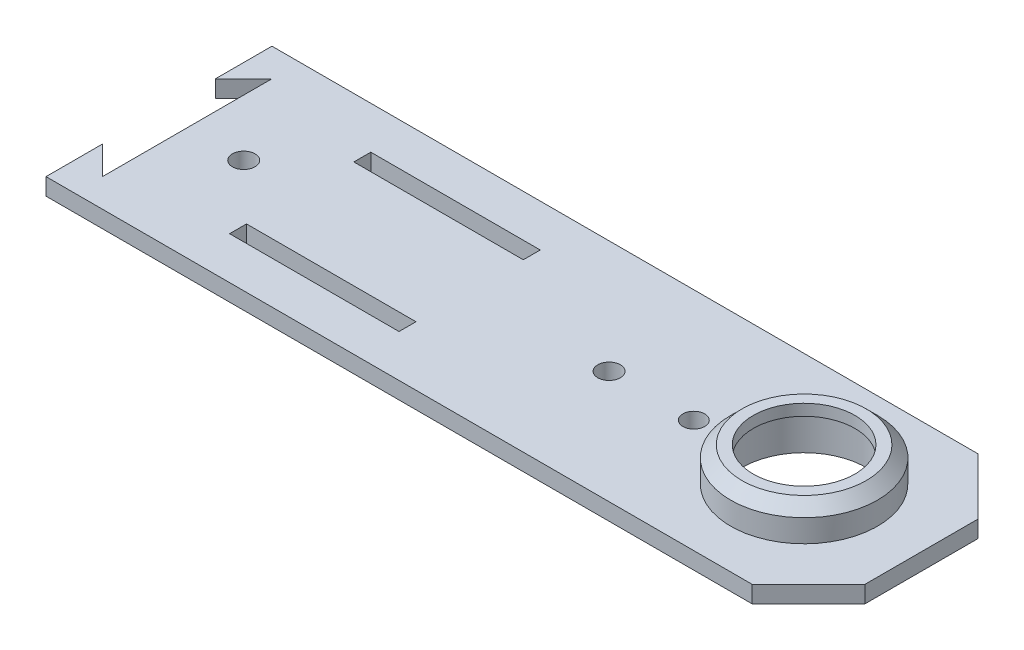
ISO-10303-21;
HEADER;
FILE_DESCRIPTION(('STEP AP214'),'2;1');
FILE_NAME('part.step','',(''),(''),'','','');
FILE_SCHEMA(('AUTOMOTIVE_DESIGN { 1 0 10303 214 1 1 1 1 }'));
ENDSEC;
DATA;
#1=APPLICATION_CONTEXT('core data for automotive mechanical design processes');
#2=APPLICATION_PROTOCOL_DEFINITION('international standard','automotive_design',2000,#1);
#3=PRODUCT_CONTEXT('',#1,'mechanical');
#4=PRODUCT('Part','Part','',(#3));
#5=PRODUCT_RELATED_PRODUCT_CATEGORY('part','',(#4));
#6=PRODUCT_DEFINITION_FORMATION('','',#4);
#7=PRODUCT_DEFINITION_CONTEXT('part definition',#1,'design');
#8=PRODUCT_DEFINITION('design','',#6,#7);
#9=PRODUCT_DEFINITION_SHAPE('','',#8);
#10=(LENGTH_UNIT() NAMED_UNIT(*) SI_UNIT(.MILLI.,.METRE.));
#11=(NAMED_UNIT(*) PLANE_ANGLE_UNIT() SI_UNIT($,.RADIAN.));
#12=(NAMED_UNIT(*) SI_UNIT($,.STERADIAN.) SOLID_ANGLE_UNIT());
#13=UNCERTAINTY_MEASURE_WITH_UNIT(LENGTH_MEASURE(1.E-05),#10,'distance_accuracy_value','');
#14=(GEOMETRIC_REPRESENTATION_CONTEXT(3) GLOBAL_UNCERTAINTY_ASSIGNED_CONTEXT((#13)) GLOBAL_UNIT_ASSIGNED_CONTEXT((#10,
#11,#12)) REPRESENTATION_CONTEXT('',''));
#15=CARTESIAN_POINT('',(0.,0.,0.));
#16=DIRECTION('',(0.,0.,1.));
#17=DIRECTION('',(1.,0.,0.));
#18=AXIS2_PLACEMENT_3D('',#15,#16,#17);
#19=CARTESIAN_POINT('',(0.,3.,0.));
#20=DIRECTION('',(0.,-1.,0.));
#21=DIRECTION('',(0.,0.,-1.));
#22=AXIS2_PLACEMENT_3D('',#19,#20,#21);
#23=PLANE('',#22);
#24=DIRECTION('',(0.,0.,-1.));
#25=VECTOR('',#24,1.);
#26=CARTESIAN_POINT('',(-12.5,3.,12.5));
#27=LINE('',#26,#25);
#28=CARTESIAN_POINT('',(-12.5,3.,12.5));
#29=VERTEX_POINT('',#28);
#30=CARTESIAN_POINT('',(-12.5,3.,9.5));
#31=VERTEX_POINT('',#30);
#32=EDGE_CURVE('E170',#29,#31,#27,.T.);
#33=ORIENTED_EDGE('',*,*,#32,.F.);
#34=DIRECTION('',(1.,0.,0.));
#35=VECTOR('',#34,1.);
#36=CARTESIAN_POINT('',(-42.5,3.,12.5));
#37=LINE('',#36,#35);
#38=CARTESIAN_POINT('',(-42.5,3.,12.5));
#39=VERTEX_POINT('',#38);
#40=EDGE_CURVE('E196',#39,#29,#37,.T.);
#41=ORIENTED_EDGE('',*,*,#40,.F.);
#42=DIRECTION('',(0.,0.,1.));
#43=VECTOR('',#42,1.);
#44=CARTESIAN_POINT('',(-42.5,3.,12.5));
#45=LINE('',#44,#43);
#46=CARTESIAN_POINT('',(-42.5,3.,9.5));
#47=VERTEX_POINT('',#46);
#48=EDGE_CURVE('E194',#47,#39,#45,.T.);
#49=ORIENTED_EDGE('',*,*,#48,.F.);
#50=DIRECTION('',(-1.,0.,0.));
#51=VECTOR('',#50,1.);
#52=CARTESIAN_POINT('',(-42.5,3.,9.5));
#53=LINE('',#52,#51);
#54=EDGE_CURVE('E180',#31,#47,#53,.T.);
#55=ORIENTED_EDGE('',*,*,#54,.F.);
#56=EDGE_LOOP('',(#33,#41,#49,#55));
#57=FACE_BOUND('',#56,.T.);
#58=CARTESIAN_POINT('',(12.1857700369203,3.,0.));
#59=DIRECTION('',(0.,1.,0.));
#60=DIRECTION('',(0.,0.,1.));
#61=AXIS2_PLACEMENT_3D('',#58,#59,#60);
#62=CIRCLE('',#61,2.);
#63=CARTESIAN_POINT('',(12.1857700369203,3.,2.));
#64=VERTEX_POINT('',#63);
#65=EDGE_CURVE('E254',#64,#64,#62,.T.);
#66=ORIENTED_EDGE('',*,*,#65,.F.);
#67=EDGE_LOOP('',(#66));
#68=FACE_BOUND('',#67,.T.);
#69=CARTESIAN_POINT('',(27.1857700369203,3.,0.));
#70=DIRECTION('',(0.,1.,0.));
#71=DIRECTION('',(0.,0.,1.));
#72=AXIS2_PLACEMENT_3D('',#69,#70,#71);
#73=CIRCLE('',#72,1.93767259060063);
#74=CARTESIAN_POINT('',(27.1857700369203,3.,1.93767259060063));
#75=VERTEX_POINT('',#74);
#76=EDGE_CURVE('E260',#75,#75,#73,.T.);
#77=ORIENTED_EDGE('',*,*,#76,.F.);
#78=EDGE_LOOP('',(#77));
#79=FACE_BOUND('',#78,.T.);
#80=DIRECTION('',(1.,0.,0.));
#81=VECTOR('',#80,1.);
#82=CARTESIAN_POINT('',(-67.5,3.,20.));
#83=LINE('',#82,#81);
#84=CARTESIAN_POINT('',(-67.5,3.,20.));
#85=VERTEX_POINT('',#84);
#86=CARTESIAN_POINT('',(57.5,3.,20.));
#87=VERTEX_POINT('',#86);
#88=EDGE_CURVE('E281',#85,#87,#83,.T.);
#89=ORIENTED_EDGE('',*,*,#88,.T.);
#90=DIRECTION('',(-0.707106781186548,0.,0.707106781186547));
#91=VECTOR('',#90,1.);
#92=CARTESIAN_POINT('',(67.5,3.,9.99999999999999));
#93=LINE('',#92,#91);
#94=CARTESIAN_POINT('',(67.5,3.,9.99999999999999));
#95=VERTEX_POINT('',#94);
#96=EDGE_CURVE('E49',#87,#95,#93,.F.);
#97=ORIENTED_EDGE('',*,*,#96,.T.);
#98=DIRECTION('',(0.,0.,-1.));
#99=VECTOR('',#98,1.);
#100=CARTESIAN_POINT('',(67.5,3.,20.));
#101=LINE('',#100,#99);
#102=CARTESIAN_POINT('',(67.5,3.,-9.99999999999995));
#103=VERTEX_POINT('',#102);
#104=EDGE_CURVE('E266',#95,#103,#101,.T.);
#105=ORIENTED_EDGE('',*,*,#104,.T.);
#106=DIRECTION('',(0.707106781186546,0.,0.707106781186549));
#107=VECTOR('',#106,1.);
#108=CARTESIAN_POINT('',(57.5,3.,-20.));
#109=LINE('',#108,#107);
#110=CARTESIAN_POINT('',(57.5,3.,-20.));
#111=VERTEX_POINT('',#110);
#112=EDGE_CURVE('E56',#103,#111,#109,.F.);
#113=ORIENTED_EDGE('',*,*,#112,.T.);
#114=DIRECTION('',(-1.,0.,0.));
#115=VECTOR('',#114,1.);
#116=CARTESIAN_POINT('',(-67.5,3.,-20.));
#117=LINE('',#116,#115);
#118=CARTESIAN_POINT('',(-67.5,3.,-20.));
#119=VERTEX_POINT('',#118);
#120=EDGE_CURVE('E268',#111,#119,#117,.T.);
#121=ORIENTED_EDGE('',*,*,#120,.T.);
#122=DIRECTION('',(0.,0.,1.));
#123=VECTOR('',#122,1.);
#124=CARTESIAN_POINT('',(-67.5,3.,-10.0000000000001));
#125=LINE('',#124,#123);
#126=CARTESIAN_POINT('',(-67.5,3.,-10.0000000000001));
#127=VERTEX_POINT('',#126);
#128=EDGE_CURVE('E271',#119,#127,#125,.T.);
#129=ORIENTED_EDGE('',*,*,#128,.T.);
#130=DIRECTION('',(0.707106781186548,0.,-0.707106781186547));
#131=VECTOR('',#130,1.);
#132=CARTESIAN_POINT('',(-67.5,3.,-10.0000000000001));
#133=LINE('',#132,#131);
#134=CARTESIAN_POINT('',(-62.5,3.,-15.));
#135=VERTEX_POINT('',#134);
#136=EDGE_CURVE('E273',#127,#135,#133,.T.);
#137=ORIENTED_EDGE('',*,*,#136,.T.);
#138=DIRECTION('',(0.,0.,1.));
#139=VECTOR('',#138,1.);
#140=CARTESIAN_POINT('',(-62.5,3.,-15.));
#141=LINE('',#140,#139);
#142=CARTESIAN_POINT('',(-62.5,3.,15.));
#143=VERTEX_POINT('',#142);
#144=EDGE_CURVE('E275',#135,#143,#141,.T.);
#145=ORIENTED_EDGE('',*,*,#144,.T.);
#146=DIRECTION('',(-0.707106781186538,0.,-0.707106781186556));
#147=VECTOR('',#146,1.);
#148=CARTESIAN_POINT('',(-62.5,3.,15.));
#149=LINE('',#148,#147);
#150=CARTESIAN_POINT('',(-67.5,3.,9.99999999999992));
#151=VERTEX_POINT('',#150);
#152=EDGE_CURVE('E277',#143,#151,#149,.T.);
#153=ORIENTED_EDGE('',*,*,#152,.T.);
#154=DIRECTION('',(0.,0.,1.));
#155=VECTOR('',#154,1.);
#156=CARTESIAN_POINT('',(-67.5,3.,20.));
#157=LINE('',#156,#155);
#158=EDGE_CURVE('E279',#151,#85,#157,.T.);
#159=ORIENTED_EDGE('',*,*,#158,.T.);
#160=EDGE_LOOP('',(#89,#97,#105,#113,#121,#129,#137,#145,#153,#159));
#161=FACE_BOUND('',#160,.T.);
#162=DIRECTION('',(0.,0.,-1.));
#163=VECTOR('',#162,1.);
#164=CARTESIAN_POINT('',(-12.5,3.,-9.5));
#165=LINE('',#164,#163);
#166=CARTESIAN_POINT('',(-12.5,3.,-9.5));
#167=VERTEX_POINT('',#166);
#168=CARTESIAN_POINT('',(-12.5,3.,-12.5));
#169=VERTEX_POINT('',#168);
#170=EDGE_CURVE('E220',#167,#169,#165,.T.);
#171=ORIENTED_EDGE('',*,*,#170,.F.);
#172=DIRECTION('',(1.,0.,0.));
#173=VECTOR('',#172,1.);
#174=CARTESIAN_POINT('',(-42.5,3.,-9.5));
#175=LINE('',#174,#173);
#176=CARTESIAN_POINT('',(-42.5,3.,-9.5));
#177=VERTEX_POINT('',#176);
#178=EDGE_CURVE('E228',#177,#167,#175,.T.);
#179=ORIENTED_EDGE('',*,*,#178,.F.);
#180=DIRECTION('',(0.,0.,1.));
#181=VECTOR('',#180,1.);
#182=CARTESIAN_POINT('',(-42.5,3.,-9.5));
#183=LINE('',#182,#181);
#184=CARTESIAN_POINT('',(-42.5,3.,-12.5));
#185=VERTEX_POINT('',#184);
#186=EDGE_CURVE('E225',#185,#177,#183,.T.);
#187=ORIENTED_EDGE('',*,*,#186,.F.);
#188=DIRECTION('',(-1.,0.,0.));
#189=VECTOR('',#188,1.);
#190=CARTESIAN_POINT('',(-42.5,3.,-12.5));
#191=LINE('',#190,#189);
#192=EDGE_CURVE('E222',#169,#185,#191,.T.);
#193=ORIENTED_EDGE('',*,*,#192,.F.);
#194=EDGE_LOOP('',(#171,#179,#187,#193));
#195=FACE_BOUND('',#194,.T.);
#196=CARTESIAN_POINT('',(-52.5,3.,0.));
#197=DIRECTION('',(0.,1.,0.));
#198=DIRECTION('',(0.,0.,1.));
#199=AXIS2_PLACEMENT_3D('',#196,#197,#198);
#200=CIRCLE('',#199,2.);
#201=CARTESIAN_POINT('',(-52.5,3.,2.));
#202=VERTEX_POINT('',#201);
#203=EDGE_CURVE('E214',#202,#202,#200,.T.);
#204=ORIENTED_EDGE('',*,*,#203,.F.);
#205=EDGE_LOOP('',(#204));
#206=FACE_BOUND('',#205,.T.);
#207=CARTESIAN_POINT('',(46.7139511037718,3.,0.));
#208=DIRECTION('',(0.,-1.,0.));
#209=DIRECTION('',(0.,0.,-1.));
#210=AXIS2_PLACEMENT_3D('',#207,#208,#209);
#211=CIRCLE('',#210,13.);
#212=CARTESIAN_POINT('',(46.7139511037718,3.,-13.));
#213=VERTEX_POINT('',#212);
#214=EDGE_CURVE('E316',#213,#213,#211,.F.);
#215=ORIENTED_EDGE('',*,*,#214,.F.);
#216=EDGE_LOOP('',(#215));
#217=FACE_BOUND('',#216,.T.);
#218=ADVANCED_FACE('F40',(#57,#68,#79,#161,#195,#206,#217),#23,.F.);
#219=CARTESIAN_POINT('',(0.,0.,0.));
#220=DIRECTION('',(0.,-1.,0.));
#221=DIRECTION('',(0.,0.,-1.));
#222=AXIS2_PLACEMENT_3D('',#219,#220,#221);
#223=PLANE('',#222);
#224=DIRECTION('',(1.,0.,0.));
#225=VECTOR('',#224,1.);
#226=CARTESIAN_POINT('',(-42.5,0.,-9.5));
#227=LINE('',#226,#225);
#228=CARTESIAN_POINT('',(-42.5,0.,-9.5));
#229=VERTEX_POINT('',#228);
#230=CARTESIAN_POINT('',(-12.5,0.,-9.5));
#231=VERTEX_POINT('',#230);
#232=EDGE_CURVE('E223',#229,#231,#227,.T.);
#233=ORIENTED_EDGE('',*,*,#232,.T.);
#234=DIRECTION('',(0.,0.,-1.));
#235=VECTOR('',#234,1.);
#236=CARTESIAN_POINT('',(-12.5,0.,-9.5));
#237=LINE('',#236,#235);
#238=CARTESIAN_POINT('',(-12.5,0.,-12.5));
#239=VERTEX_POINT('',#238);
#240=EDGE_CURVE('E217',#231,#239,#237,.T.);
#241=ORIENTED_EDGE('',*,*,#240,.T.);
#242=DIRECTION('',(-1.,0.,0.));
#243=VECTOR('',#242,1.);
#244=CARTESIAN_POINT('',(-42.5,0.,-12.5));
#245=LINE('',#244,#243);
#246=CARTESIAN_POINT('',(-42.5,0.,-12.5));
#247=VERTEX_POINT('',#246);
#248=EDGE_CURVE('E233',#239,#247,#245,.T.);
#249=ORIENTED_EDGE('',*,*,#248,.T.);
#250=DIRECTION('',(0.,0.,1.));
#251=VECTOR('',#250,1.);
#252=CARTESIAN_POINT('',(-42.5,0.,-9.5));
#253=LINE('',#252,#251);
#254=EDGE_CURVE('E236',#247,#229,#253,.T.);
#255=ORIENTED_EDGE('',*,*,#254,.T.);
#256=EDGE_LOOP('',(#233,#241,#249,#255));
#257=FACE_BOUND('',#256,.T.);
#258=CARTESIAN_POINT('',(46.7139511037718,0.,0.));
#259=DIRECTION('',(0.,1.,0.));
#260=DIRECTION('',(0.,0.,1.));
#261=AXIS2_PLACEMENT_3D('',#258,#259,#260);
#262=CIRCLE('',#261,11.);
#263=CARTESIAN_POINT('',(46.7139511037718,0.,11.));
#264=VERTEX_POINT('',#263);
#265=EDGE_CURVE('E250',#264,#264,#262,.T.);
#266=ORIENTED_EDGE('',*,*,#265,.T.);
#267=EDGE_LOOP('',(#266));
#268=FACE_BOUND('',#267,.T.);
#269=CARTESIAN_POINT('',(27.1857700369203,0.,0.));
#270=DIRECTION('',(0.,1.,0.));
#271=DIRECTION('',(0.,0.,1.));
#272=AXIS2_PLACEMENT_3D('',#269,#270,#271);
#273=CIRCLE('',#272,1.93767259060063);
#274=CARTESIAN_POINT('',(27.1857700369203,0.,1.93767259060063));
#275=VERTEX_POINT('',#274);
#276=EDGE_CURVE('E257',#275,#275,#273,.T.);
#277=ORIENTED_EDGE('',*,*,#276,.T.);
#278=EDGE_LOOP('',(#277));
#279=FACE_BOUND('',#278,.T.);
#280=DIRECTION('',(0.,0.,-1.));
#281=VECTOR('',#280,1.);
#282=CARTESIAN_POINT('',(67.5,0.,20.));
#283=LINE('',#282,#281);
#284=CARTESIAN_POINT('',(67.5,0.,9.99999999999999));
#285=VERTEX_POINT('',#284);
#286=CARTESIAN_POINT('',(67.5,0.,-9.99999999999995));
#287=VERTEX_POINT('',#286);
#288=EDGE_CURVE('E263',#285,#287,#283,.T.);
#289=ORIENTED_EDGE('',*,*,#288,.F.);
#290=DIRECTION('',(0.707106781186548,0.,-0.707106781186547));
#291=VECTOR('',#290,1.);
#292=CARTESIAN_POINT('',(38.75,0.,38.75));
#293=LINE('',#292,#291);
#294=CARTESIAN_POINT('',(57.5,0.,20.));
#295=VERTEX_POINT('',#294);
#296=EDGE_CURVE('E332',#285,#295,#293,.F.);
#297=ORIENTED_EDGE('',*,*,#296,.T.);
#298=DIRECTION('',(1.,0.,0.));
#299=VECTOR('',#298,1.);
#300=CARTESIAN_POINT('',(-67.5,0.,20.));
#301=LINE('',#300,#299);
#302=CARTESIAN_POINT('',(-67.5,0.,20.));
#303=VERTEX_POINT('',#302);
#304=EDGE_CURVE('E269',#303,#295,#301,.T.);
#305=ORIENTED_EDGE('',*,*,#304,.F.);
#306=DIRECTION('',(0.,0.,1.));
#307=VECTOR('',#306,1.);
#308=CARTESIAN_POINT('',(-67.5,0.,20.));
#309=LINE('',#308,#307);
#310=CARTESIAN_POINT('',(-67.5,0.,9.99999999999992));
#311=VERTEX_POINT('',#310);
#312=EDGE_CURVE('E296',#311,#303,#309,.T.);
#313=ORIENTED_EDGE('',*,*,#312,.F.);
#314=DIRECTION('',(-0.707106781186538,0.,-0.707106781186556));
#315=VECTOR('',#314,1.);
#316=CARTESIAN_POINT('',(-62.5,0.,15.));
#317=LINE('',#316,#315);
#318=CARTESIAN_POINT('',(-62.5,0.,15.));
#319=VERTEX_POINT('',#318);
#320=EDGE_CURVE('E294',#319,#311,#317,.T.);
#321=ORIENTED_EDGE('',*,*,#320,.F.);
#322=DIRECTION('',(0.,0.,1.));
#323=VECTOR('',#322,1.);
#324=CARTESIAN_POINT('',(-62.5,0.,-15.));
#325=LINE('',#324,#323);
#326=CARTESIAN_POINT('',(-62.5,0.,-15.));
#327=VERTEX_POINT('',#326);
#328=EDGE_CURVE('E292',#327,#319,#325,.T.);
#329=ORIENTED_EDGE('',*,*,#328,.F.);
#330=DIRECTION('',(0.707106781186548,0.,-0.707106781186547));
#331=VECTOR('',#330,1.);
#332=CARTESIAN_POINT('',(-67.5,0.,-10.0000000000001));
#333=LINE('',#332,#331);
#334=CARTESIAN_POINT('',(-67.5,0.,-10.0000000000001));
#335=VERTEX_POINT('',#334);
#336=EDGE_CURVE('E290',#335,#327,#333,.T.);
#337=ORIENTED_EDGE('',*,*,#336,.F.);
#338=DIRECTION('',(0.,0.,1.));
#339=VECTOR('',#338,1.);
#340=CARTESIAN_POINT('',(-67.5,0.,-10.0000000000001));
#341=LINE('',#340,#339);
#342=CARTESIAN_POINT('',(-67.5,0.,-20.));
#343=VERTEX_POINT('',#342);
#344=EDGE_CURVE('E288',#343,#335,#341,.T.);
#345=ORIENTED_EDGE('',*,*,#344,.F.);
#346=DIRECTION('',(-1.,0.,0.));
#347=VECTOR('',#346,1.);
#348=CARTESIAN_POINT('',(-67.5,0.,-20.));
#349=LINE('',#348,#347);
#350=CARTESIAN_POINT('',(57.5,0.,-20.));
#351=VERTEX_POINT('',#350);
#352=EDGE_CURVE('E286',#351,#343,#349,.T.);
#353=ORIENTED_EDGE('',*,*,#352,.F.);
#354=DIRECTION('',(-0.707106781186546,0.,-0.707106781186549));
#355=VECTOR('',#354,1.);
#356=CARTESIAN_POINT('',(38.7500000000001,0.,-38.75));
#357=LINE('',#356,#355);
#358=EDGE_CURVE('E330',#351,#287,#357,.F.);
#359=ORIENTED_EDGE('',*,*,#358,.T.);
#360=EDGE_LOOP('',(#289,#297,#305,#313,#321,#329,#337,#345,#353,#359));
#361=FACE_BOUND('',#360,.T.);
#362=CARTESIAN_POINT('',(12.1857700369203,0.,0.));
#363=DIRECTION('',(0.,1.,0.));
#364=DIRECTION('',(0.,0.,1.));
#365=AXIS2_PLACEMENT_3D('',#362,#363,#364);
#366=CIRCLE('',#365,2.);
#367=CARTESIAN_POINT('',(12.1857700369203,0.,2.));
#368=VERTEX_POINT('',#367);
#369=EDGE_CURVE('E253',#368,#368,#366,.T.);
#370=ORIENTED_EDGE('',*,*,#369,.T.);
#371=EDGE_LOOP('',(#370));
#372=FACE_BOUND('',#371,.T.);
#373=CARTESIAN_POINT('',(-52.5,0.,0.));
#374=DIRECTION('',(0.,1.,0.));
#375=DIRECTION('',(0.,0.,1.));
#376=AXIS2_PLACEMENT_3D('',#373,#374,#375);
#377=CIRCLE('',#376,2.);
#378=CARTESIAN_POINT('',(-52.5,0.,2.));
#379=VERTEX_POINT('',#378);
#380=EDGE_CURVE('E188',#379,#379,#377,.T.);
#381=ORIENTED_EDGE('',*,*,#380,.T.);
#382=EDGE_LOOP('',(#381));
#383=FACE_BOUND('',#382,.T.);
#384=DIRECTION('',(1.,0.,0.));
#385=VECTOR('',#384,1.);
#386=CARTESIAN_POINT('',(-42.5,0.,12.5));
#387=LINE('',#386,#385);
#388=CARTESIAN_POINT('',(-42.5,0.,12.5));
#389=VERTEX_POINT('',#388);
#390=CARTESIAN_POINT('',(-12.5,0.,12.5));
#391=VERTEX_POINT('',#390);
#392=EDGE_CURVE('E181',#389,#391,#387,.T.);
#393=ORIENTED_EDGE('',*,*,#392,.T.);
#394=DIRECTION('',(0.,0.,-1.));
#395=VECTOR('',#394,1.);
#396=CARTESIAN_POINT('',(-12.5,0.,12.5));
#397=LINE('',#396,#395);
#398=CARTESIAN_POINT('',(-12.5,0.,9.5));
#399=VERTEX_POINT('',#398);
#400=EDGE_CURVE('E201',#391,#399,#397,.T.);
#401=ORIENTED_EDGE('',*,*,#400,.T.);
#402=DIRECTION('',(-1.,0.,0.));
#403=VECTOR('',#402,1.);
#404=CARTESIAN_POINT('',(-42.5,0.,9.5));
#405=LINE('',#404,#403);
#406=CARTESIAN_POINT('',(-42.5,0.,9.5));
#407=VERTEX_POINT('',#406);
#408=EDGE_CURVE('E187',#399,#407,#405,.T.);
#409=ORIENTED_EDGE('',*,*,#408,.T.);
#410=DIRECTION('',(0.,0.,1.));
#411=VECTOR('',#410,1.);
#412=CARTESIAN_POINT('',(-42.5,0.,12.5));
#413=LINE('',#412,#411);
#414=EDGE_CURVE('E205',#407,#389,#413,.T.);
#415=ORIENTED_EDGE('',*,*,#414,.T.);
#416=EDGE_LOOP('',(#393,#401,#409,#415));
#417=FACE_BOUND('',#416,.T.);
#418=ADVANCED_FACE('F347',(#257,#268,#279,#361,#372,#383,#417),#223,.T.);
#419=CARTESIAN_POINT('',(67.5,3.,20.));
#420=DIRECTION('',(-1.,0.,0.));
#421=DIRECTION('',(0.,0.,1.));
#422=AXIS2_PLACEMENT_3D('',#419,#420,#421);
#423=PLANE('',#422);
#424=ORIENTED_EDGE('',*,*,#104,.F.);
#425=DIRECTION('',(0.,-1.,0.));
#426=VECTOR('',#425,1.);
#427=CARTESIAN_POINT('',(67.5,3.,9.99999999999999));
#428=LINE('',#427,#426);
#429=EDGE_CURVE('E327',#95,#285,#428,.T.);
#430=ORIENTED_EDGE('',*,*,#429,.T.);
#431=ORIENTED_EDGE('',*,*,#288,.T.);
#432=DIRECTION('',(0.,1.,0.));
#433=VECTOR('',#432,1.);
#434=CARTESIAN_POINT('',(67.5,3.,-9.99999999999995));
#435=LINE('',#434,#433);
#436=EDGE_CURVE('E325',#287,#103,#435,.T.);
#437=ORIENTED_EDGE('',*,*,#436,.T.);
#438=EDGE_LOOP('',(#424,#430,#431,#437));
#439=FACE_BOUND('',#438,.T.);
#440=ADVANCED_FACE('F341',(#439),#423,.F.);
#441=CARTESIAN_POINT('',(-67.5,3.,-20.));
#442=DIRECTION('',(0.,0.,1.));
#443=DIRECTION('',(1.,0.,0.));
#444=AXIS2_PLACEMENT_3D('',#441,#442,#443);
#445=PLANE('',#444);
#446=ORIENTED_EDGE('',*,*,#120,.F.);
#447=DIRECTION('',(0.,-1.,0.));
#448=VECTOR('',#447,1.);
#449=CARTESIAN_POINT('',(57.5,3.,-20.));
#450=LINE('',#449,#448);
#451=EDGE_CURVE('E11',#111,#351,#450,.T.);
#452=ORIENTED_EDGE('',*,*,#451,.T.);
#453=ORIENTED_EDGE('',*,*,#352,.T.);
#454=DIRECTION('',(0.,-1.,0.));
#455=VECTOR('',#454,1.);
#456=CARTESIAN_POINT('',(-67.5,3.,-20.));
#457=LINE('',#456,#455);
#458=EDGE_CURVE('E313',#119,#343,#457,.T.);
#459=ORIENTED_EDGE('',*,*,#458,.F.);
#460=EDGE_LOOP('',(#446,#452,#453,#459));
#461=FACE_BOUND('',#460,.T.);
#462=ADVANCED_FACE('F378',(#461),#445,.F.);
#463=CARTESIAN_POINT('',(-67.5,3.,-10.0000000000001));
#464=DIRECTION('',(1.,0.,0.));
#465=DIRECTION('',(0.,0.,-1.));
#466=AXIS2_PLACEMENT_3D('',#463,#464,#465);
#467=PLANE('',#466);
#468=ORIENTED_EDGE('',*,*,#344,.T.);
#469=DIRECTION('',(0.,-1.,0.));
#470=VECTOR('',#469,1.);
#471=CARTESIAN_POINT('',(-67.5,3.,-10.0000000000001));
#472=LINE('',#471,#470);
#473=EDGE_CURVE('E310',#127,#335,#472,.T.);
#474=ORIENTED_EDGE('',*,*,#473,.F.);
#475=ORIENTED_EDGE('',*,*,#128,.F.);
#476=ORIENTED_EDGE('',*,*,#458,.T.);
#477=EDGE_LOOP('',(#468,#474,#475,#476));
#478=FACE_BOUND('',#477,.T.);
#479=ADVANCED_FACE('F374',(#478),#467,.F.);
#480=CARTESIAN_POINT('',(-67.5,3.,-10.0000000000001));
#481=DIRECTION('',(-0.707106781186547,0.,-0.707106781186548));
#482=DIRECTION('',(-0.707106781186548,0.,0.707106781186547));
#483=AXIS2_PLACEMENT_3D('',#480,#481,#482);
#484=PLANE('',#483);
#485=ORIENTED_EDGE('',*,*,#336,.T.);
#486=DIRECTION('',(0.,-1.,0.));
#487=VECTOR('',#486,1.);
#488=CARTESIAN_POINT('',(-62.5,3.,-15.));
#489=LINE('',#488,#487);
#490=EDGE_CURVE('E307',#135,#327,#489,.T.);
#491=ORIENTED_EDGE('',*,*,#490,.F.);
#492=ORIENTED_EDGE('',*,*,#136,.F.);
#493=ORIENTED_EDGE('',*,*,#473,.T.);
#494=EDGE_LOOP('',(#485,#491,#492,#493));
#495=FACE_BOUND('',#494,.T.);
#496=ADVANCED_FACE('F369',(#495),#484,.F.);
#497=CARTESIAN_POINT('',(-62.5,3.,-15.));
#498=DIRECTION('',(1.,0.,0.));
#499=DIRECTION('',(0.,0.,-1.));
#500=AXIS2_PLACEMENT_3D('',#497,#498,#499);
#501=PLANE('',#500);
#502=ORIENTED_EDGE('',*,*,#328,.T.);
#503=DIRECTION('',(0.,-1.,0.));
#504=VECTOR('',#503,1.);
#505=CARTESIAN_POINT('',(-62.5,3.,15.));
#506=LINE('',#505,#504);
#507=EDGE_CURVE('E304',#143,#319,#506,.T.);
#508=ORIENTED_EDGE('',*,*,#507,.F.);
#509=ORIENTED_EDGE('',*,*,#144,.F.);
#510=ORIENTED_EDGE('',*,*,#490,.T.);
#511=EDGE_LOOP('',(#502,#508,#509,#510));
#512=FACE_BOUND('',#511,.T.);
#513=ADVANCED_FACE('F365',(#512),#501,.F.);
#514=CARTESIAN_POINT('',(-62.5,3.,15.));
#515=DIRECTION('',(-0.707106781186557,0.,0.707106781186538));
#516=DIRECTION('',(0.707106781186538,0.,0.707106781186557));
#517=AXIS2_PLACEMENT_3D('',#514,#515,#516);
#518=PLANE('',#517);
#519=ORIENTED_EDGE('',*,*,#320,.T.);
#520=DIRECTION('',(0.,-1.,0.));
#521=VECTOR('',#520,1.);
#522=CARTESIAN_POINT('',(-67.5,3.,9.99999999999992));
#523=LINE('',#522,#521);
#524=EDGE_CURVE('E301',#151,#311,#523,.T.);
#525=ORIENTED_EDGE('',*,*,#524,.F.);
#526=ORIENTED_EDGE('',*,*,#152,.F.);
#527=ORIENTED_EDGE('',*,*,#507,.T.);
#528=EDGE_LOOP('',(#519,#525,#526,#527));
#529=FACE_BOUND('',#528,.T.);
#530=ADVANCED_FACE('F360',(#529),#518,.F.);
#531=CARTESIAN_POINT('',(-67.5,3.,20.));
#532=DIRECTION('',(1.,0.,0.));
#533=DIRECTION('',(0.,0.,-1.));
#534=AXIS2_PLACEMENT_3D('',#531,#532,#533);
#535=PLANE('',#534);
#536=ORIENTED_EDGE('',*,*,#312,.T.);
#537=DIRECTION('',(0.,-1.,0.));
#538=VECTOR('',#537,1.);
#539=CARTESIAN_POINT('',(-67.5,3.,20.));
#540=LINE('',#539,#538);
#541=EDGE_CURVE('E283',#85,#303,#540,.T.);
#542=ORIENTED_EDGE('',*,*,#541,.F.);
#543=ORIENTED_EDGE('',*,*,#158,.F.);
#544=ORIENTED_EDGE('',*,*,#524,.T.);
#545=EDGE_LOOP('',(#536,#542,#543,#544));
#546=FACE_BOUND('',#545,.T.);
#547=ADVANCED_FACE('F354',(#546),#535,.F.);
#548=CARTESIAN_POINT('',(-67.5,3.,20.));
#549=DIRECTION('',(0.,0.,-1.));
#550=DIRECTION('',(-1.,0.,0.));
#551=AXIS2_PLACEMENT_3D('',#548,#549,#550);
#552=PLANE('',#551);
#553=ORIENTED_EDGE('',*,*,#304,.T.);
#554=DIRECTION('',(0.,1.,0.));
#555=VECTOR('',#554,1.);
#556=CARTESIAN_POINT('',(57.5,3.,20.));
#557=LINE('',#556,#555);
#558=EDGE_CURVE('E64',#295,#87,#557,.T.);
#559=ORIENTED_EDGE('',*,*,#558,.T.);
#560=ORIENTED_EDGE('',*,*,#88,.F.);
#561=ORIENTED_EDGE('',*,*,#541,.T.);
#562=EDGE_LOOP('',(#553,#559,#560,#561));
#563=FACE_BOUND('',#562,.T.);
#564=ADVANCED_FACE('F350',(#563),#552,.F.);
#565=CARTESIAN_POINT('',(27.1857700369203,3.,0.));
#566=DIRECTION('',(0.,-1.,0.));
#567=DIRECTION('',(0.,0.,-1.));
#568=AXIS2_PLACEMENT_3D('',#565,#566,#567);
#569=CYLINDRICAL_SURFACE('',#568,1.93767259060063);
#570=ORIENTED_EDGE('',*,*,#76,.T.);
#571=EDGE_LOOP('',(#570));
#572=FACE_BOUND('',#571,.T.);
#573=ORIENTED_EDGE('',*,*,#276,.F.);
#574=EDGE_LOOP('',(#573));
#575=FACE_BOUND('',#574,.T.);
#576=ADVANCED_FACE('F394',(#572,#575),#569,.F.);
#577=CARTESIAN_POINT('',(12.1857700369203,3.,0.));
#578=DIRECTION('',(0.,-1.,0.));
#579=DIRECTION('',(0.,0.,-1.));
#580=AXIS2_PLACEMENT_3D('',#577,#578,#579);
#581=CYLINDRICAL_SURFACE('',#580,2.);
#582=ORIENTED_EDGE('',*,*,#65,.T.);
#583=EDGE_LOOP('',(#582));
#584=FACE_BOUND('',#583,.T.);
#585=ORIENTED_EDGE('',*,*,#369,.F.);
#586=EDGE_LOOP('',(#585));
#587=FACE_BOUND('',#586,.T.);
#588=ADVANCED_FACE('F458',(#584,#587),#581,.F.);
#589=CARTESIAN_POINT('',(46.7139511037718,3.,0.));
#590=DIRECTION('',(0.,-1.,0.));
#591=DIRECTION('',(0.,0.,-1.));
#592=AXIS2_PLACEMENT_3D('',#589,#590,#591);
#593=CYLINDRICAL_SURFACE('',#592,11.);
#594=ORIENTED_EDGE('',*,*,#265,.F.);
#595=EDGE_LOOP('',(#594));
#596=FACE_BOUND('',#595,.T.);
#597=CARTESIAN_POINT('',(46.7139511037718,7.,0.));
#598=DIRECTION('',(0.,1.,0.));
#599=DIRECTION('',(0.,0.,1.));
#600=AXIS2_PLACEMENT_3D('',#597,#598,#599);
#601=CIRCLE('',#600,11.);
#602=CARTESIAN_POINT('',(46.7139511037718,7.,11.));
#603=VERTEX_POINT('',#602);
#604=EDGE_CURVE('E203',#603,#603,#601,.T.);
#605=ORIENTED_EDGE('',*,*,#604,.T.);
#606=EDGE_LOOP('',(#605));
#607=FACE_BOUND('',#606,.T.);
#608=ADVANCED_FACE('F455',(#596,#607),#593,.F.);
#609=CARTESIAN_POINT('',(-12.5,3.,-9.5));
#610=DIRECTION('',(-1.,0.,0.));
#611=DIRECTION('',(0.,0.,1.));
#612=AXIS2_PLACEMENT_3D('',#609,#610,#611);
#613=PLANE('',#612);
#614=ORIENTED_EDGE('',*,*,#240,.F.);
#615=DIRECTION('',(0.,-1.,0.));
#616=VECTOR('',#615,1.);
#617=CARTESIAN_POINT('',(-12.5,3.,-9.5));
#618=LINE('',#617,#616);
#619=EDGE_CURVE('E230',#167,#231,#618,.T.);
#620=ORIENTED_EDGE('',*,*,#619,.F.);
#621=ORIENTED_EDGE('',*,*,#170,.T.);
#622=DIRECTION('',(0.,-1.,0.));
#623=VECTOR('',#622,1.);
#624=CARTESIAN_POINT('',(-12.5,3.,-12.5));
#625=LINE('',#624,#623);
#626=EDGE_CURVE('E247',#169,#239,#625,.T.);
#627=ORIENTED_EDGE('',*,*,#626,.T.);
#628=EDGE_LOOP('',(#614,#620,#621,#627));
#629=FACE_BOUND('',#628,.T.);
#630=ADVANCED_FACE('F457',(#629),#613,.T.);
#631=CARTESIAN_POINT('',(-42.5,3.,-12.5));
#632=DIRECTION('',(0.,0.,1.));
#633=DIRECTION('',(1.,0.,0.));
#634=AXIS2_PLACEMENT_3D('',#631,#632,#633);
#635=PLANE('',#634);
#636=ORIENTED_EDGE('',*,*,#248,.F.);
#637=ORIENTED_EDGE('',*,*,#626,.F.);
#638=ORIENTED_EDGE('',*,*,#192,.T.);
#639=DIRECTION('',(0.,-1.,0.));
#640=VECTOR('',#639,1.);
#641=CARTESIAN_POINT('',(-42.5,3.,-12.5));
#642=LINE('',#641,#640);
#643=EDGE_CURVE('E245',#185,#247,#642,.T.);
#644=ORIENTED_EDGE('',*,*,#643,.T.);
#645=EDGE_LOOP('',(#636,#637,#638,#644));
#646=FACE_BOUND('',#645,.T.);
#647=ADVANCED_FACE('F465',(#646),#635,.T.);
#648=CARTESIAN_POINT('',(-42.5,3.,-9.5));
#649=DIRECTION('',(1.,0.,0.));
#650=DIRECTION('',(0.,0.,-1.));
#651=AXIS2_PLACEMENT_3D('',#648,#649,#650);
#652=PLANE('',#651);
#653=ORIENTED_EDGE('',*,*,#254,.F.);
#654=ORIENTED_EDGE('',*,*,#643,.F.);
#655=ORIENTED_EDGE('',*,*,#186,.T.);
#656=DIRECTION('',(0.,-1.,0.));
#657=VECTOR('',#656,1.);
#658=CARTESIAN_POINT('',(-42.5,3.,-9.5));
#659=LINE('',#658,#657);
#660=EDGE_CURVE('E243',#177,#229,#659,.T.);
#661=ORIENTED_EDGE('',*,*,#660,.T.);
#662=EDGE_LOOP('',(#653,#654,#655,#661));
#663=FACE_BOUND('',#662,.T.);
#664=ADVANCED_FACE('F473',(#663),#652,.T.);
#665=CARTESIAN_POINT('',(-42.5,3.,-9.5));
#666=DIRECTION('',(0.,0.,-1.));
#667=DIRECTION('',(-1.,0.,0.));
#668=AXIS2_PLACEMENT_3D('',#665,#666,#667);
#669=PLANE('',#668);
#670=ORIENTED_EDGE('',*,*,#232,.F.);
#671=ORIENTED_EDGE('',*,*,#660,.F.);
#672=ORIENTED_EDGE('',*,*,#178,.T.);
#673=ORIENTED_EDGE('',*,*,#619,.T.);
#674=EDGE_LOOP('',(#670,#671,#672,#673));
#675=FACE_BOUND('',#674,.T.);
#676=ADVANCED_FACE('F477',(#675),#669,.T.);
#677=CARTESIAN_POINT('',(-52.5,3.,0.));
#678=DIRECTION('',(0.,-1.,0.));
#679=DIRECTION('',(0.,0.,-1.));
#680=AXIS2_PLACEMENT_3D('',#677,#678,#679);
#681=CYLINDRICAL_SURFACE('',#680,2.);
#682=ORIENTED_EDGE('',*,*,#203,.T.);
#683=EDGE_LOOP('',(#682));
#684=FACE_BOUND('',#683,.T.);
#685=ORIENTED_EDGE('',*,*,#380,.F.);
#686=EDGE_LOOP('',(#685));
#687=FACE_BOUND('',#686,.T.);
#688=ADVANCED_FACE('F481',(#684,#687),#681,.F.);
#689=CARTESIAN_POINT('',(-12.5,3.,12.5));
#690=DIRECTION('',(-1.,0.,0.));
#691=DIRECTION('',(0.,0.,1.));
#692=AXIS2_PLACEMENT_3D('',#689,#690,#691);
#693=PLANE('',#692);
#694=ORIENTED_EDGE('',*,*,#400,.F.);
#695=DIRECTION('',(0.,-1.,0.));
#696=VECTOR('',#695,1.);
#697=CARTESIAN_POINT('',(-12.5,3.,12.5));
#698=LINE('',#697,#696);
#699=EDGE_CURVE('E176',#29,#391,#698,.T.);
#700=ORIENTED_EDGE('',*,*,#699,.F.);
#701=ORIENTED_EDGE('',*,*,#32,.T.);
#702=DIRECTION('',(0.,-1.,0.));
#703=VECTOR('',#702,1.);
#704=CARTESIAN_POINT('',(-12.5,3.,9.5));
#705=LINE('',#704,#703);
#706=EDGE_CURVE('E173',#31,#399,#705,.T.);
#707=ORIENTED_EDGE('',*,*,#706,.T.);
#708=EDGE_LOOP('',(#694,#700,#701,#707));
#709=FACE_BOUND('',#708,.T.);
#710=ADVANCED_FACE('F172',(#709),#693,.T.);
#711=CARTESIAN_POINT('',(-42.5,3.,9.5));
#712=DIRECTION('',(0.,0.,1.));
#713=DIRECTION('',(1.,0.,0.));
#714=AXIS2_PLACEMENT_3D('',#711,#712,#713);
#715=PLANE('',#714);
#716=ORIENTED_EDGE('',*,*,#408,.F.);
#717=ORIENTED_EDGE('',*,*,#706,.F.);
#718=ORIENTED_EDGE('',*,*,#54,.T.);
#719=DIRECTION('',(0.,-1.,0.));
#720=VECTOR('',#719,1.);
#721=CARTESIAN_POINT('',(-42.5,3.,9.5));
#722=LINE('',#721,#720);
#723=EDGE_CURVE('E189',#47,#407,#722,.T.);
#724=ORIENTED_EDGE('',*,*,#723,.T.);
#725=EDGE_LOOP('',(#716,#717,#718,#724));
#726=FACE_BOUND('',#725,.T.);
#727=ADVANCED_FACE('F184',(#726),#715,.T.);
#728=CARTESIAN_POINT('',(-42.5,3.,12.5));
#729=DIRECTION('',(1.,0.,0.));
#730=DIRECTION('',(0.,0.,-1.));
#731=AXIS2_PLACEMENT_3D('',#728,#729,#730);
#732=PLANE('',#731);
#733=ORIENTED_EDGE('',*,*,#414,.F.);
#734=ORIENTED_EDGE('',*,*,#723,.F.);
#735=ORIENTED_EDGE('',*,*,#48,.T.);
#736=DIRECTION('',(0.,-1.,0.));
#737=VECTOR('',#736,1.);
#738=CARTESIAN_POINT('',(-42.5,3.,12.5));
#739=LINE('',#738,#737);
#740=EDGE_CURVE('E211',#39,#389,#739,.T.);
#741=ORIENTED_EDGE('',*,*,#740,.T.);
#742=EDGE_LOOP('',(#733,#734,#735,#741));
#743=FACE_BOUND('',#742,.T.);
#744=ADVANCED_FACE('F490',(#743),#732,.T.);
#745=CARTESIAN_POINT('',(-42.5,3.,12.5));
#746=DIRECTION('',(0.,0.,-1.));
#747=DIRECTION('',(-1.,0.,0.));
#748=AXIS2_PLACEMENT_3D('',#745,#746,#747);
#749=PLANE('',#748);
#750=ORIENTED_EDGE('',*,*,#392,.F.);
#751=ORIENTED_EDGE('',*,*,#740,.F.);
#752=ORIENTED_EDGE('',*,*,#40,.T.);
#753=ORIENTED_EDGE('',*,*,#699,.T.);
#754=EDGE_LOOP('',(#750,#751,#752,#753));
#755=FACE_BOUND('',#754,.T.);
#756=ADVANCED_FACE('F493',(#755),#749,.T.);
#757=CARTESIAN_POINT('',(46.7139511037718,7.,0.));
#758=DIRECTION('',(0.,-1.,0.));
#759=DIRECTION('',(0.,0.,-1.));
#760=AXIS2_PLACEMENT_3D('',#757,#758,#759);
#761=CYLINDRICAL_SURFACE('',#760,13.);
#762=CARTESIAN_POINT('',(46.7139511037718,7.00000000000001,0.));
#763=DIRECTION('',(0.,1.,0.));
#764=DIRECTION('',(0.,0.,1.));
#765=AXIS2_PLACEMENT_3D('',#762,#763,#764);
#766=CIRCLE('',#765,13.);
#767=CARTESIAN_POINT('',(46.7139511037718,7.00000000000001,13.));
#768=VERTEX_POINT('',#767);
#769=EDGE_CURVE('E322',#768,#768,#766,.F.);
#770=ORIENTED_EDGE('',*,*,#769,.T.);
#771=EDGE_LOOP('',(#770));
#772=FACE_BOUND('',#771,.T.);
#773=ORIENTED_EDGE('',*,*,#214,.T.);
#774=EDGE_LOOP('',(#773));
#775=FACE_BOUND('',#774,.T.);
#776=ADVANCED_FACE('F451',(#772,#775),#761,.T.);
#777=CARTESIAN_POINT('',(46.7139511037718,7.,0.));
#778=DIRECTION('',(0.,1.,0.));
#779=DIRECTION('',(0.,0.,1.));
#780=AXIS2_PLACEMENT_3D('',#777,#778,#779);
#781=PLANE('',#780);
#782=CARTESIAN_POINT('',(46.7139511037718,7.,0.));
#783=DIRECTION('',(0.,1.,0.));
#784=DIRECTION('',(0.,0.,1.));
#785=AXIS2_PLACEMENT_3D('',#782,#783,#784);
#786=CIRCLE('',#785,9.);
#787=CARTESIAN_POINT('',(46.7139511037718,7.,9.));
#788=VERTEX_POINT('',#787);
#789=EDGE_CURVE('E441',#788,#788,#786,.T.);
#790=ORIENTED_EDGE('',*,*,#789,.T.);
#791=EDGE_LOOP('',(#790));
#792=FACE_BOUND('',#791,.T.);
#793=ORIENTED_EDGE('',*,*,#604,.F.);
#794=EDGE_LOOP('',(#793));
#795=FACE_BOUND('',#794,.T.);
#796=ADVANCED_FACE('F436',(#792,#795),#781,.F.);
#797=CARTESIAN_POINT('',(46.7139511037718,9.,0.));
#798=DIRECTION('',(0.,1.,0.));
#799=DIRECTION('',(0.,0.,1.));
#800=AXIS2_PLACEMENT_3D('',#797,#798,#799);
#801=PLANE('',#800);
#802=CARTESIAN_POINT('',(46.7139511037718,9.,0.));
#803=DIRECTION('',(0.,1.,0.));
#804=DIRECTION('',(0.,0.,1.));
#805=AXIS2_PLACEMENT_3D('',#802,#803,#804);
#806=CIRCLE('',#805,11.);
#807=CARTESIAN_POINT('',(46.7139511037718,9.,11.));
#808=VERTEX_POINT('',#807);
#809=EDGE_CURVE('E319',#808,#808,#806,.T.);
#810=ORIENTED_EDGE('',*,*,#809,.T.);
#811=EDGE_LOOP('',(#810));
#812=FACE_BOUND('',#811,.T.);
#813=CARTESIAN_POINT('',(46.7139511037718,9.,0.));
#814=DIRECTION('',(0.,1.,0.));
#815=DIRECTION('',(0.,0.,1.));
#816=AXIS2_PLACEMENT_3D('',#813,#814,#815);
#817=CIRCLE('',#816,9.);
#818=CARTESIAN_POINT('',(46.7139511037718,9.,9.));
#819=VERTEX_POINT('',#818);
#820=EDGE_CURVE('E440',#819,#819,#817,.T.);
#821=ORIENTED_EDGE('',*,*,#820,.F.);
#822=EDGE_LOOP('',(#821));
#823=FACE_BOUND('',#822,.T.);
#824=ADVANCED_FACE('F427',(#812,#823),#801,.T.);
#825=CARTESIAN_POINT('',(46.7139511037718,9.,0.));
#826=DIRECTION('',(0.,-1.,0.));
#827=DIRECTION('',(0.,0.,-1.));
#828=AXIS2_PLACEMENT_3D('',#825,#826,#827);
#829=CYLINDRICAL_SURFACE('',#828,9.);
#830=ORIENTED_EDGE('',*,*,#820,.T.);
#831=EDGE_LOOP('',(#830));
#832=FACE_BOUND('',#831,.T.);
#833=ORIENTED_EDGE('',*,*,#789,.F.);
#834=EDGE_LOOP('',(#833));
#835=FACE_BOUND('',#834,.T.);
#836=ADVANCED_FACE('F418',(#832,#835),#829,.F.);
#837=CARTESIAN_POINT('',(46.7139511037718,9.,0.));
#838=DIRECTION('',(0.,-1.,0.));
#839=DIRECTION('',(0.,0.,-1.));
#840=AXIS2_PLACEMENT_3D('',#837,#838,#839);
#841=CONICAL_SURFACE('',#840,11.,0.785398163397447);
#842=ORIENTED_EDGE('',*,*,#769,.F.);
#843=EDGE_LOOP('',(#842));
#844=FACE_BOUND('',#843,.T.);
#845=ORIENTED_EDGE('',*,*,#809,.F.);
#846=EDGE_LOOP('',(#845));
#847=FACE_BOUND('',#846,.T.);
#848=ADVANCED_FACE('F385',(#844,#847),#841,.T.);
#849=CARTESIAN_POINT('',(67.5,3.,9.99999999999999));
#850=DIRECTION('',(-0.707106781186547,0.,-0.707106781186548));
#851=DIRECTION('',(0.,-1.,0.));
#852=AXIS2_PLACEMENT_3D('',#849,#850,#851);
#853=PLANE('',#852);
#854=ORIENTED_EDGE('',*,*,#96,.F.);
#855=ORIENTED_EDGE('',*,*,#558,.F.);
#856=ORIENTED_EDGE('',*,*,#296,.F.);
#857=ORIENTED_EDGE('',*,*,#429,.F.);
#858=EDGE_LOOP('',(#854,#855,#856,#857));
#859=FACE_BOUND('',#858,.T.);
#860=ADVANCED_FACE('F344',(#859),#853,.F.);
#861=CARTESIAN_POINT('',(57.5,3.,-20.));
#862=DIRECTION('',(-0.707106781186549,0.,0.707106781186546));
#863=DIRECTION('',(0.,-1.,0.));
#864=AXIS2_PLACEMENT_3D('',#861,#862,#863);
#865=PLANE('',#864);
#866=ORIENTED_EDGE('',*,*,#112,.F.);
#867=ORIENTED_EDGE('',*,*,#436,.F.);
#868=ORIENTED_EDGE('',*,*,#358,.F.);
#869=ORIENTED_EDGE('',*,*,#451,.F.);
#870=EDGE_LOOP('',(#866,#867,#868,#869));
#871=FACE_BOUND('',#870,.T.);
#872=ADVANCED_FACE('F43',(#871),#865,.F.);
#873=CLOSED_SHELL('',(#218,#418,#440,#462,#479,#496,#513,#530,#547,#564,#576,#588,#608,#630,
#647,#664,#676,#688,#710,#727,#744,#756,#776,#796,#824,#836,#848,#860,#872));
#874=MANIFOLD_SOLID_BREP('B2',#873);
#875=ADVANCED_BREP_SHAPE_REPRESENTATION('',(#18,#874),#14);
#876=SHAPE_DEFINITION_REPRESENTATION(#9,#875);
ENDSEC;
END-ISO-10303-21;
